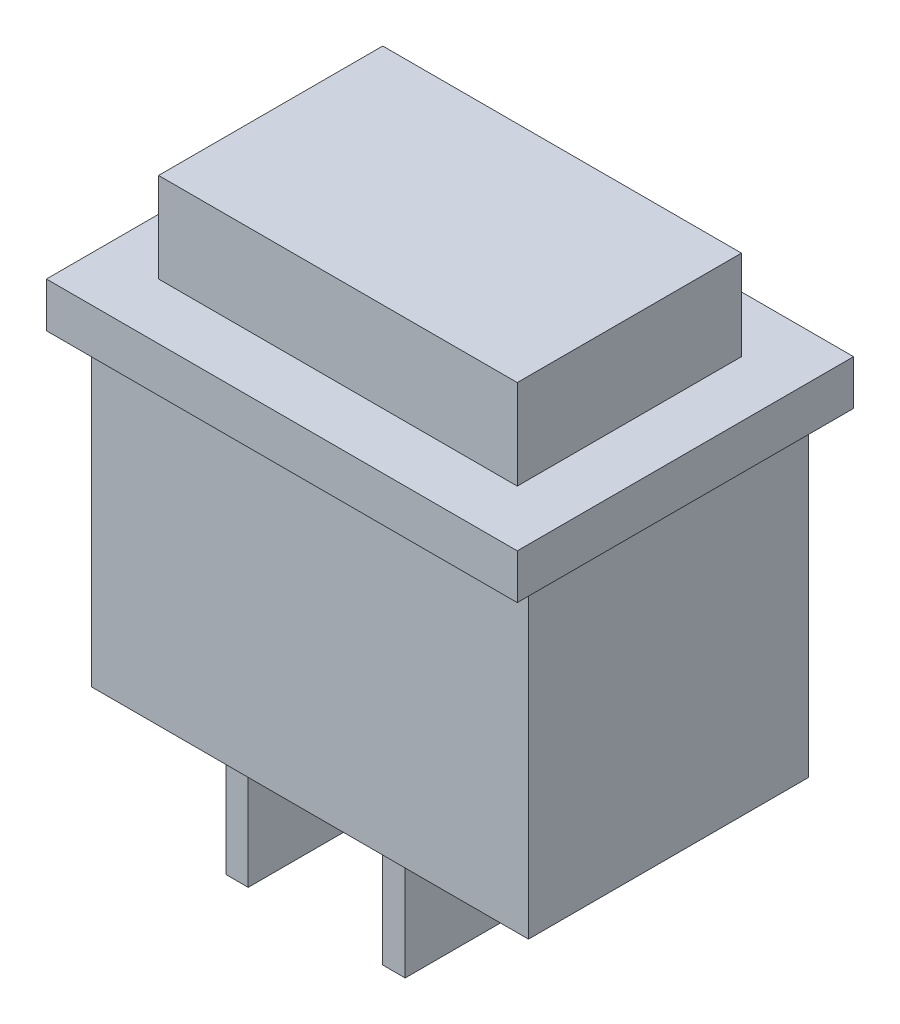
ISO-10303-21;
HEADER;
FILE_DESCRIPTION(('STEP AP214'),'2;1');
FILE_NAME('part.step','',(''),(''),'','','');
FILE_SCHEMA(('AUTOMOTIVE_DESIGN { 1 0 10303 214 1 1 1 1 }'));
ENDSEC;
DATA;
#1=APPLICATION_CONTEXT('core data for automotive mechanical design processes');
#2=APPLICATION_PROTOCOL_DEFINITION('international standard','automotive_design',2000,#1);
#3=PRODUCT_CONTEXT('',#1,'mechanical');
#4=PRODUCT('Part','Part','',(#3));
#5=PRODUCT_RELATED_PRODUCT_CATEGORY('part','',(#4));
#6=PRODUCT_DEFINITION_FORMATION('','',#4);
#7=PRODUCT_DEFINITION_CONTEXT('part definition',#1,'design');
#8=PRODUCT_DEFINITION('design','',#6,#7);
#9=PRODUCT_DEFINITION_SHAPE('','',#8);
#10=(LENGTH_UNIT() NAMED_UNIT(*) SI_UNIT(.MILLI.,.METRE.));
#11=(NAMED_UNIT(*) PLANE_ANGLE_UNIT() SI_UNIT($,.RADIAN.));
#12=(NAMED_UNIT(*) SI_UNIT($,.STERADIAN.) SOLID_ANGLE_UNIT());
#13=UNCERTAINTY_MEASURE_WITH_UNIT(LENGTH_MEASURE(1.E-05),#10,'distance_accuracy_value','');
#14=(GEOMETRIC_REPRESENTATION_CONTEXT(3) GLOBAL_UNCERTAINTY_ASSIGNED_CONTEXT((#13)) GLOBAL_UNIT_ASSIGNED_CONTEXT((#10,
#11,#12)) REPRESENTATION_CONTEXT('',''));
#15=CARTESIAN_POINT('',(0.,0.,0.));
#16=DIRECTION('',(0.,0.,1.));
#17=DIRECTION('',(1.,0.,0.));
#18=AXIS2_PLACEMENT_3D('',#15,#16,#17);
#19=CARTESIAN_POINT('',(0.,-14.,0.));
#20=DIRECTION('',(0.,-1.,0.));
#21=DIRECTION('',(0.,0.,-1.));
#22=AXIS2_PLACEMENT_3D('',#19,#20,#21);
#23=PLANE('',#22);
#24=DIRECTION('',(0.,0.,1.));
#25=VECTOR('',#24,1.);
#26=CARTESIAN_POINT('',(9.75,-14.,6.25));
#27=LINE('',#26,#25);
#28=CARTESIAN_POINT('',(9.75,-14.,-6.25));
#29=VERTEX_POINT('',#28);
#30=CARTESIAN_POINT('',(9.75,-14.,6.25));
#31=VERTEX_POINT('',#30);
#32=EDGE_CURVE('E228',#29,#31,#27,.T.);
#33=ORIENTED_EDGE('',*,*,#32,.T.);
#34=DIRECTION('',(-1.,0.,0.));
#35=VECTOR('',#34,1.);
#36=CARTESIAN_POINT('',(-9.75,-14.,6.25));
#37=LINE('',#36,#35);
#38=CARTESIAN_POINT('',(-9.75,-14.,6.25));
#39=VERTEX_POINT('',#38);
#40=EDGE_CURVE('E231',#31,#39,#37,.T.);
#41=ORIENTED_EDGE('',*,*,#40,.T.);
#42=DIRECTION('',(0.,0.,-1.));
#43=VECTOR('',#42,1.);
#44=CARTESIAN_POINT('',(-9.75,-14.,6.25));
#45=LINE('',#44,#43);
#46=CARTESIAN_POINT('',(-9.75,-14.,-6.25));
#47=VERTEX_POINT('',#46);
#48=EDGE_CURVE('E234',#39,#47,#45,.T.);
#49=ORIENTED_EDGE('',*,*,#48,.T.);
#50=DIRECTION('',(1.,0.,0.));
#51=VECTOR('',#50,1.);
#52=CARTESIAN_POINT('',(-9.75,-14.,-6.25));
#53=LINE('',#52,#51);
#54=EDGE_CURVE('E236',#47,#29,#53,.T.);
#55=ORIENTED_EDGE('',*,*,#54,.T.);
#56=EDGE_LOOP('',(#33,#41,#49,#55));
#57=FACE_BOUND('',#56,.T.);
#58=DIRECTION('',(-1.,0.,0.));
#59=VECTOR('',#58,1.);
#60=CARTESIAN_POINT('',(-7.5,-14.,2.5));
#61=LINE('',#60,#59);
#62=CARTESIAN_POINT('',(-6.5,-14.,2.5));
#63=VERTEX_POINT('',#62);
#64=CARTESIAN_POINT('',(-7.5,-14.,2.5));
#65=VERTEX_POINT('',#64);
#66=EDGE_CURVE('E199',#63,#65,#61,.T.);
#67=ORIENTED_EDGE('',*,*,#66,.F.);
#68=DIRECTION('',(0.,0.,1.));
#69=VECTOR('',#68,1.);
#70=CARTESIAN_POINT('',(-6.5,-14.,-2.5));
#71=LINE('',#70,#69);
#72=CARTESIAN_POINT('',(-6.5,-14.,-2.5));
#73=VERTEX_POINT('',#72);
#74=EDGE_CURVE('E196',#73,#63,#71,.T.);
#75=ORIENTED_EDGE('',*,*,#74,.F.);
#76=DIRECTION('',(1.,0.,0.));
#77=VECTOR('',#76,1.);
#78=CARTESIAN_POINT('',(-7.5,-14.,-2.5));
#79=LINE('',#78,#77);
#80=CARTESIAN_POINT('',(-7.5,-14.,-2.5));
#81=VERTEX_POINT('',#80);
#82=EDGE_CURVE('E208',#81,#73,#79,.T.);
#83=ORIENTED_EDGE('',*,*,#82,.F.);
#84=DIRECTION('',(0.,0.,-1.));
#85=VECTOR('',#84,1.);
#86=CARTESIAN_POINT('',(-7.5,-14.,-2.5));
#87=LINE('',#86,#85);
#88=EDGE_CURVE('E216',#65,#81,#87,.T.);
#89=ORIENTED_EDGE('',*,*,#88,.F.);
#90=EDGE_LOOP('',(#67,#75,#83,#89));
#91=FACE_BOUND('',#90,.T.);
#92=DIRECTION('',(-1.,0.,0.));
#93=VECTOR('',#92,1.);
#94=CARTESIAN_POINT('',(-0.5,-14.,2.5));
#95=LINE('',#94,#93);
#96=CARTESIAN_POINT('',(0.5,-14.,2.5));
#97=VERTEX_POINT('',#96);
#98=CARTESIAN_POINT('',(-0.5,-14.,2.5));
#99=VERTEX_POINT('',#98);
#100=EDGE_CURVE('E581',#97,#99,#95,.T.);
#101=ORIENTED_EDGE('',*,*,#100,.F.);
#102=DIRECTION('',(0.,0.,1.));
#103=VECTOR('',#102,1.);
#104=CARTESIAN_POINT('',(0.5,-14.,-2.5));
#105=LINE('',#104,#103);
#106=CARTESIAN_POINT('',(0.5,-14.,-2.5));
#107=VERTEX_POINT('',#106);
#108=EDGE_CURVE('E194',#107,#97,#105,.T.);
#109=ORIENTED_EDGE('',*,*,#108,.F.);
#110=DIRECTION('',(1.,0.,0.));
#111=VECTOR('',#110,1.);
#112=CARTESIAN_POINT('',(-0.5,-14.,-2.5));
#113=LINE('',#112,#111);
#114=CARTESIAN_POINT('',(-0.5,-14.,-2.5));
#115=VERTEX_POINT('',#114);
#116=EDGE_CURVE('E190',#115,#107,#113,.T.);
#117=ORIENTED_EDGE('',*,*,#116,.F.);
#118=DIRECTION('',(0.,0.,-1.));
#119=VECTOR('',#118,1.);
#120=CARTESIAN_POINT('',(-0.5,-14.,-2.5));
#121=LINE('',#120,#119);
#122=EDGE_CURVE('E578',#99,#115,#121,.T.);
#123=ORIENTED_EDGE('',*,*,#122,.F.);
#124=EDGE_LOOP('',(#101,#109,#117,#123));
#125=FACE_BOUND('',#124,.T.);
#126=ADVANCED_FACE('F33',(#57,#91,#125),#23,.T.);
#127=CARTESIAN_POINT('',(0.,0.,0.));
#128=DIRECTION('',(0.,1.,0.));
#129=DIRECTION('',(0.,0.,1.));
#130=AXIS2_PLACEMENT_3D('',#127,#128,#129);
#131=PLANE('',#130);
#132=DIRECTION('',(0.,0.,-1.));
#133=VECTOR('',#132,1.);
#134=CARTESIAN_POINT('',(10.5,0.,-7.5));
#135=LINE('',#134,#133);
#136=CARTESIAN_POINT('',(10.5,0.,7.5));
#137=VERTEX_POINT('',#136);
#138=CARTESIAN_POINT('',(10.5,0.,-7.5));
#139=VERTEX_POINT('',#138);
#140=EDGE_CURVE('E289',#137,#139,#135,.T.);
#141=ORIENTED_EDGE('',*,*,#140,.F.);
#142=DIRECTION('',(1.,0.,0.));
#143=VECTOR('',#142,1.);
#144=CARTESIAN_POINT('',(-10.5,0.,7.5));
#145=LINE('',#144,#143);
#146=CARTESIAN_POINT('',(-10.5,0.,7.5));
#147=VERTEX_POINT('',#146);
#148=EDGE_CURVE('E294',#147,#137,#145,.T.);
#149=ORIENTED_EDGE('',*,*,#148,.F.);
#150=DIRECTION('',(0.,0.,1.));
#151=VECTOR('',#150,1.);
#152=CARTESIAN_POINT('',(-10.5,0.,-7.5));
#153=LINE('',#152,#151);
#154=CARTESIAN_POINT('',(-10.5,0.,-7.5));
#155=VERTEX_POINT('',#154);
#156=EDGE_CURVE('E305',#155,#147,#153,.T.);
#157=ORIENTED_EDGE('',*,*,#156,.F.);
#158=DIRECTION('',(-1.,0.,0.));
#159=VECTOR('',#158,1.);
#160=CARTESIAN_POINT('',(-10.5,0.,-7.5));
#161=LINE('',#160,#159);
#162=EDGE_CURVE('E303',#139,#155,#161,.T.);
#163=ORIENTED_EDGE('',*,*,#162,.F.);
#164=EDGE_LOOP('',(#141,#149,#157,#163));
#165=FACE_BOUND('',#164,.T.);
#166=DIRECTION('',(0.,0.,1.));
#167=VECTOR('',#166,1.);
#168=CARTESIAN_POINT('',(9.75,0.,6.25));
#169=LINE('',#168,#167);
#170=CARTESIAN_POINT('',(9.75,0.,-6.25));
#171=VERTEX_POINT('',#170);
#172=CARTESIAN_POINT('',(9.75,0.,6.25));
#173=VERTEX_POINT('',#172);
#174=EDGE_CURVE('E227',#171,#173,#169,.T.);
#175=ORIENTED_EDGE('',*,*,#174,.F.);
#176=DIRECTION('',(1.,0.,0.));
#177=VECTOR('',#176,1.);
#178=CARTESIAN_POINT('',(-9.75,0.,-6.25));
#179=LINE('',#178,#177);
#180=CARTESIAN_POINT('',(-9.75,0.,-6.25));
#181=VERTEX_POINT('',#180);
#182=EDGE_CURVE('E232',#181,#171,#179,.T.);
#183=ORIENTED_EDGE('',*,*,#182,.F.);
#184=DIRECTION('',(0.,0.,-1.));
#185=VECTOR('',#184,1.);
#186=CARTESIAN_POINT('',(-9.75,0.,6.25));
#187=LINE('',#186,#185);
#188=CARTESIAN_POINT('',(-9.75,0.,6.25));
#189=VERTEX_POINT('',#188);
#190=EDGE_CURVE('E244',#189,#181,#187,.T.);
#191=ORIENTED_EDGE('',*,*,#190,.F.);
#192=DIRECTION('',(-1.,0.,0.));
#193=VECTOR('',#192,1.);
#194=CARTESIAN_POINT('',(-9.75,0.,6.25));
#195=LINE('',#194,#193);
#196=EDGE_CURVE('E241',#173,#189,#195,.T.);
#197=ORIENTED_EDGE('',*,*,#196,.F.);
#198=EDGE_LOOP('',(#175,#183,#191,#197));
#199=FACE_BOUND('',#198,.T.);
#200=ADVANCED_FACE('F323',(#165,#199),#131,.F.);
#201=CARTESIAN_POINT('',(0.,2.,0.));
#202=DIRECTION('',(0.,1.,0.));
#203=DIRECTION('',(0.,0.,1.));
#204=AXIS2_PLACEMENT_3D('',#201,#202,#203);
#205=PLANE('',#204);
#206=DIRECTION('',(0.,0.,-1.));
#207=VECTOR('',#206,1.);
#208=CARTESIAN_POINT('',(10.5,2.,-7.5));
#209=LINE('',#208,#207);
#210=CARTESIAN_POINT('',(10.5,2.,7.5));
#211=VERTEX_POINT('',#210);
#212=CARTESIAN_POINT('',(10.5,2.,-7.5));
#213=VERTEX_POINT('',#212);
#214=EDGE_CURVE('E290',#211,#213,#209,.T.);
#215=ORIENTED_EDGE('',*,*,#214,.T.);
#216=DIRECTION('',(-1.,0.,0.));
#217=VECTOR('',#216,1.);
#218=CARTESIAN_POINT('',(-10.5,2.,-7.5));
#219=LINE('',#218,#217);
#220=CARTESIAN_POINT('',(-10.5,2.,-7.5));
#221=VERTEX_POINT('',#220);
#222=EDGE_CURVE('E293',#213,#221,#219,.T.);
#223=ORIENTED_EDGE('',*,*,#222,.T.);
#224=DIRECTION('',(0.,0.,1.));
#225=VECTOR('',#224,1.);
#226=CARTESIAN_POINT('',(-10.5,2.,-7.5));
#227=LINE('',#226,#225);
#228=CARTESIAN_POINT('',(-10.5,2.,7.5));
#229=VERTEX_POINT('',#228);
#230=EDGE_CURVE('E296',#221,#229,#227,.T.);
#231=ORIENTED_EDGE('',*,*,#230,.T.);
#232=DIRECTION('',(1.,0.,0.));
#233=VECTOR('',#232,1.);
#234=CARTESIAN_POINT('',(-10.5,2.,7.5));
#235=LINE('',#234,#233);
#236=EDGE_CURVE('E298',#229,#211,#235,.T.);
#237=ORIENTED_EDGE('',*,*,#236,.T.);
#238=EDGE_LOOP('',(#215,#223,#231,#237));
#239=FACE_BOUND('',#238,.T.);
#240=DIRECTION('',(-1.,0.,0.));
#241=VECTOR('',#240,1.);
#242=CARTESIAN_POINT('',(-8.,2.,-5.));
#243=LINE('',#242,#241);
#244=CARTESIAN_POINT('',(8.,2.,-5.));
#245=VERTEX_POINT('',#244);
#246=CARTESIAN_POINT('',(-8.,2.,-5.));
#247=VERTEX_POINT('',#246);
#248=EDGE_CURVE('E274',#245,#247,#243,.T.);
#249=ORIENTED_EDGE('',*,*,#248,.F.);
#250=DIRECTION('',(0.,0.,-1.));
#251=VECTOR('',#250,1.);
#252=CARTESIAN_POINT('',(8.,2.,-5.));
#253=LINE('',#252,#251);
#254=CARTESIAN_POINT('',(8.,2.,5.));
#255=VERTEX_POINT('',#254);
#256=EDGE_CURVE('E260',#255,#245,#253,.T.);
#257=ORIENTED_EDGE('',*,*,#256,.F.);
#258=DIRECTION('',(1.,0.,0.));
#259=VECTOR('',#258,1.);
#260=CARTESIAN_POINT('',(-8.,2.,5.));
#261=LINE('',#260,#259);
#262=CARTESIAN_POINT('',(-8.,2.,5.));
#263=VERTEX_POINT('',#262);
#264=EDGE_CURVE('E265',#263,#255,#261,.T.);
#265=ORIENTED_EDGE('',*,*,#264,.F.);
#266=DIRECTION('',(0.,0.,1.));
#267=VECTOR('',#266,1.);
#268=CARTESIAN_POINT('',(-8.,2.,-5.));
#269=LINE('',#268,#267);
#270=EDGE_CURVE('E276',#247,#263,#269,.T.);
#271=ORIENTED_EDGE('',*,*,#270,.F.);
#272=EDGE_LOOP('',(#249,#257,#265,#271));
#273=FACE_BOUND('',#272,.T.);
#274=ADVANCED_FACE('F333',(#239,#273),#205,.T.);
#275=CARTESIAN_POINT('',(10.5,2.,-7.5));
#276=DIRECTION('',(-1.,0.,0.));
#277=DIRECTION('',(0.,0.,1.));
#278=AXIS2_PLACEMENT_3D('',#275,#276,#277);
#279=PLANE('',#278);
#280=ORIENTED_EDGE('',*,*,#140,.T.);
#281=DIRECTION('',(0.,-1.,0.));
#282=VECTOR('',#281,1.);
#283=CARTESIAN_POINT('',(10.5,2.,-7.5));
#284=LINE('',#283,#282);
#285=EDGE_CURVE('E11',#213,#139,#284,.T.);
#286=ORIENTED_EDGE('',*,*,#285,.F.);
#287=ORIENTED_EDGE('',*,*,#214,.F.);
#288=DIRECTION('',(0.,-1.,0.));
#289=VECTOR('',#288,1.);
#290=CARTESIAN_POINT('',(10.5,2.,7.5));
#291=LINE('',#290,#289);
#292=EDGE_CURVE('E300',#211,#137,#291,.T.);
#293=ORIENTED_EDGE('',*,*,#292,.T.);
#294=EDGE_LOOP('',(#280,#286,#287,#293));
#295=FACE_BOUND('',#294,.T.);
#296=ADVANCED_FACE('F35',(#295),#279,.F.);
#297=CARTESIAN_POINT('',(-10.5,2.,-7.5));
#298=DIRECTION('',(0.,0.,1.));
#299=DIRECTION('',(1.,0.,0.));
#300=AXIS2_PLACEMENT_3D('',#297,#298,#299);
#301=PLANE('',#300);
#302=ORIENTED_EDGE('',*,*,#162,.T.);
#303=DIRECTION('',(0.,-1.,0.));
#304=VECTOR('',#303,1.);
#305=CARTESIAN_POINT('',(-10.5,2.,-7.5));
#306=LINE('',#305,#304);
#307=EDGE_CURVE('E41',#221,#155,#306,.T.);
#308=ORIENTED_EDGE('',*,*,#307,.F.);
#309=ORIENTED_EDGE('',*,*,#222,.F.);
#310=ORIENTED_EDGE('',*,*,#285,.T.);
#311=EDGE_LOOP('',(#302,#308,#309,#310));
#312=FACE_BOUND('',#311,.T.);
#313=ADVANCED_FACE('F335',(#312),#301,.F.);
#314=CARTESIAN_POINT('',(-10.5,2.,-7.5));
#315=DIRECTION('',(1.,0.,0.));
#316=DIRECTION('',(0.,0.,-1.));
#317=AXIS2_PLACEMENT_3D('',#314,#315,#316);
#318=PLANE('',#317);
#319=ORIENTED_EDGE('',*,*,#156,.T.);
#320=DIRECTION('',(0.,-1.,0.));
#321=VECTOR('',#320,1.);
#322=CARTESIAN_POINT('',(-10.5,2.,7.5));
#323=LINE('',#322,#321);
#324=EDGE_CURVE('E310',#229,#147,#323,.T.);
#325=ORIENTED_EDGE('',*,*,#324,.F.);
#326=ORIENTED_EDGE('',*,*,#230,.F.);
#327=ORIENTED_EDGE('',*,*,#307,.T.);
#328=EDGE_LOOP('',(#319,#325,#326,#327));
#329=FACE_BOUND('',#328,.T.);
#330=ADVANCED_FACE('F317',(#329),#318,.F.);
#331=CARTESIAN_POINT('',(-10.5,2.,7.5));
#332=DIRECTION('',(0.,0.,-1.));
#333=DIRECTION('',(-1.,0.,0.));
#334=AXIS2_PLACEMENT_3D('',#331,#332,#333);
#335=PLANE('',#334);
#336=ORIENTED_EDGE('',*,*,#148,.T.);
#337=ORIENTED_EDGE('',*,*,#292,.F.);
#338=ORIENTED_EDGE('',*,*,#236,.F.);
#339=ORIENTED_EDGE('',*,*,#324,.T.);
#340=EDGE_LOOP('',(#336,#337,#338,#339));
#341=FACE_BOUND('',#340,.T.);
#342=ADVANCED_FACE('F327',(#341),#335,.F.);
#343=CARTESIAN_POINT('',(8.,6.,-5.));
#344=DIRECTION('',(-1.,0.,0.));
#345=DIRECTION('',(0.,0.,1.));
#346=AXIS2_PLACEMENT_3D('',#343,#344,#345);
#347=PLANE('',#346);
#348=ORIENTED_EDGE('',*,*,#256,.T.);
#349=DIRECTION('',(0.,-1.,0.));
#350=VECTOR('',#349,1.);
#351=CARTESIAN_POINT('',(8.,6.,-5.));
#352=LINE('',#351,#350);
#353=CARTESIAN_POINT('',(8.,6.,-5.));
#354=VERTEX_POINT('',#353);
#355=EDGE_CURVE('E287',#354,#245,#352,.T.);
#356=ORIENTED_EDGE('',*,*,#355,.F.);
#357=DIRECTION('',(0.,0.,-1.));
#358=VECTOR('',#357,1.);
#359=CARTESIAN_POINT('',(8.,6.,-5.));
#360=LINE('',#359,#358);
#361=CARTESIAN_POINT('',(8.,6.,5.));
#362=VERTEX_POINT('',#361);
#363=EDGE_CURVE('E261',#362,#354,#360,.T.);
#364=ORIENTED_EDGE('',*,*,#363,.F.);
#365=DIRECTION('',(0.,-1.,0.));
#366=VECTOR('',#365,1.);
#367=CARTESIAN_POINT('',(8.,6.,5.));
#368=LINE('',#367,#366);
#369=EDGE_CURVE('E271',#362,#255,#368,.T.);
#370=ORIENTED_EDGE('',*,*,#369,.T.);
#371=EDGE_LOOP('',(#348,#356,#364,#370));
#372=FACE_BOUND('',#371,.T.);
#373=ADVANCED_FACE('F385',(#372),#347,.F.);
#374=CARTESIAN_POINT('',(-8.,6.,-5.));
#375=DIRECTION('',(0.,0.,1.));
#376=DIRECTION('',(1.,0.,0.));
#377=AXIS2_PLACEMENT_3D('',#374,#375,#376);
#378=PLANE('',#377);
#379=ORIENTED_EDGE('',*,*,#248,.T.);
#380=DIRECTION('',(0.,-1.,0.));
#381=VECTOR('',#380,1.);
#382=CARTESIAN_POINT('',(-8.,6.,-5.));
#383=LINE('',#382,#381);
#384=CARTESIAN_POINT('',(-8.,6.,-5.));
#385=VERTEX_POINT('',#384);
#386=EDGE_CURVE('E284',#385,#247,#383,.T.);
#387=ORIENTED_EDGE('',*,*,#386,.F.);
#388=DIRECTION('',(-1.,0.,0.));
#389=VECTOR('',#388,1.);
#390=CARTESIAN_POINT('',(-8.,6.,-5.));
#391=LINE('',#390,#389);
#392=EDGE_CURVE('E264',#354,#385,#391,.T.);
#393=ORIENTED_EDGE('',*,*,#392,.F.);
#394=ORIENTED_EDGE('',*,*,#355,.T.);
#395=EDGE_LOOP('',(#379,#387,#393,#394));
#396=FACE_BOUND('',#395,.T.);
#397=ADVANCED_FACE('F381',(#396),#378,.F.);
#398=CARTESIAN_POINT('',(-8.,6.,-5.));
#399=DIRECTION('',(1.,0.,0.));
#400=DIRECTION('',(0.,0.,-1.));
#401=AXIS2_PLACEMENT_3D('',#398,#399,#400);
#402=PLANE('',#401);
#403=ORIENTED_EDGE('',*,*,#270,.T.);
#404=DIRECTION('',(0.,-1.,0.));
#405=VECTOR('',#404,1.);
#406=CARTESIAN_POINT('',(-8.,6.,5.));
#407=LINE('',#406,#405);
#408=CARTESIAN_POINT('',(-8.,6.,5.));
#409=VERTEX_POINT('',#408);
#410=EDGE_CURVE('E282',#409,#263,#407,.T.);
#411=ORIENTED_EDGE('',*,*,#410,.F.);
#412=DIRECTION('',(0.,0.,1.));
#413=VECTOR('',#412,1.);
#414=CARTESIAN_POINT('',(-8.,6.,-5.));
#415=LINE('',#414,#413);
#416=EDGE_CURVE('E267',#385,#409,#415,.T.);
#417=ORIENTED_EDGE('',*,*,#416,.F.);
#418=ORIENTED_EDGE('',*,*,#386,.T.);
#419=EDGE_LOOP('',(#403,#411,#417,#418));
#420=FACE_BOUND('',#419,.T.);
#421=ADVANCED_FACE('F377',(#420),#402,.F.);
#422=CARTESIAN_POINT('',(-8.,6.,5.));
#423=DIRECTION('',(0.,0.,-1.));
#424=DIRECTION('',(-1.,0.,0.));
#425=AXIS2_PLACEMENT_3D('',#422,#423,#424);
#426=PLANE('',#425);
#427=ORIENTED_EDGE('',*,*,#264,.T.);
#428=ORIENTED_EDGE('',*,*,#369,.F.);
#429=DIRECTION('',(1.,0.,0.));
#430=VECTOR('',#429,1.);
#431=CARTESIAN_POINT('',(-8.,6.,5.));
#432=LINE('',#431,#430);
#433=EDGE_CURVE('E269',#409,#362,#432,.T.);
#434=ORIENTED_EDGE('',*,*,#433,.F.);
#435=ORIENTED_EDGE('',*,*,#410,.T.);
#436=EDGE_LOOP('',(#427,#428,#434,#435));
#437=FACE_BOUND('',#436,.T.);
#438=ADVANCED_FACE('F373',(#437),#426,.F.);
#439=CARTESIAN_POINT('',(0.,6.,0.));
#440=DIRECTION('',(0.,1.,0.));
#441=DIRECTION('',(0.,0.,1.));
#442=AXIS2_PLACEMENT_3D('',#439,#440,#441);
#443=PLANE('',#442);
#444=ORIENTED_EDGE('',*,*,#363,.T.);
#445=ORIENTED_EDGE('',*,*,#392,.T.);
#446=ORIENTED_EDGE('',*,*,#416,.T.);
#447=ORIENTED_EDGE('',*,*,#433,.T.);
#448=EDGE_LOOP('',(#444,#445,#446,#447));
#449=FACE_BOUND('',#448,.T.);
#450=ADVANCED_FACE('F369',(#449),#443,.T.);
#451=CARTESIAN_POINT('',(9.75,-14.,6.25));
#452=DIRECTION('',(-1.,0.,0.));
#453=DIRECTION('',(0.,0.,1.));
#454=AXIS2_PLACEMENT_3D('',#451,#452,#453);
#455=PLANE('',#454);
#456=ORIENTED_EDGE('',*,*,#174,.T.);
#457=DIRECTION('',(0.,1.,0.));
#458=VECTOR('',#457,1.);
#459=CARTESIAN_POINT('',(9.75,-14.,6.25));
#460=LINE('',#459,#458);
#461=EDGE_CURVE('E257',#31,#173,#460,.T.);
#462=ORIENTED_EDGE('',*,*,#461,.F.);
#463=ORIENTED_EDGE('',*,*,#32,.F.);
#464=DIRECTION('',(0.,1.,0.));
#465=VECTOR('',#464,1.);
#466=CARTESIAN_POINT('',(9.75,-14.,-6.25));
#467=LINE('',#466,#465);
#468=EDGE_CURVE('E238',#29,#171,#467,.T.);
#469=ORIENTED_EDGE('',*,*,#468,.T.);
#470=EDGE_LOOP('',(#456,#462,#463,#469));
#471=FACE_BOUND('',#470,.T.);
#472=ADVANCED_FACE('F365',(#471),#455,.F.);
#473=CARTESIAN_POINT('',(-9.75,-14.,6.25));
#474=DIRECTION('',(0.,0.,-1.));
#475=DIRECTION('',(-1.,0.,0.));
#476=AXIS2_PLACEMENT_3D('',#473,#474,#475);
#477=PLANE('',#476);
#478=ORIENTED_EDGE('',*,*,#196,.T.);
#479=DIRECTION('',(0.,1.,0.));
#480=VECTOR('',#479,1.);
#481=CARTESIAN_POINT('',(-9.75,-14.,6.25));
#482=LINE('',#481,#480);
#483=EDGE_CURVE('E254',#39,#189,#482,.T.);
#484=ORIENTED_EDGE('',*,*,#483,.F.);
#485=ORIENTED_EDGE('',*,*,#40,.F.);
#486=ORIENTED_EDGE('',*,*,#461,.T.);
#487=EDGE_LOOP('',(#478,#484,#485,#486));
#488=FACE_BOUND('',#487,.T.);
#489=ADVANCED_FACE('F361',(#488),#477,.F.);
#490=CARTESIAN_POINT('',(-9.75,-14.,6.25));
#491=DIRECTION('',(1.,0.,0.));
#492=DIRECTION('',(0.,0.,-1.));
#493=AXIS2_PLACEMENT_3D('',#490,#491,#492);
#494=PLANE('',#493);
#495=ORIENTED_EDGE('',*,*,#190,.T.);
#496=DIRECTION('',(0.,1.,0.));
#497=VECTOR('',#496,1.);
#498=CARTESIAN_POINT('',(-9.75,-14.,-6.25));
#499=LINE('',#498,#497);
#500=EDGE_CURVE('E251',#47,#181,#499,.T.);
#501=ORIENTED_EDGE('',*,*,#500,.F.);
#502=ORIENTED_EDGE('',*,*,#48,.F.);
#503=ORIENTED_EDGE('',*,*,#483,.T.);
#504=EDGE_LOOP('',(#495,#501,#502,#503));
#505=FACE_BOUND('',#504,.T.);
#506=ADVANCED_FACE('F357',(#505),#494,.F.);
#507=CARTESIAN_POINT('',(-9.75,-14.,-6.25));
#508=DIRECTION('',(0.,0.,1.));
#509=DIRECTION('',(1.,0.,0.));
#510=AXIS2_PLACEMENT_3D('',#507,#508,#509);
#511=PLANE('',#510);
#512=ORIENTED_EDGE('',*,*,#182,.T.);
#513=ORIENTED_EDGE('',*,*,#468,.F.);
#514=ORIENTED_EDGE('',*,*,#54,.F.);
#515=ORIENTED_EDGE('',*,*,#500,.T.);
#516=EDGE_LOOP('',(#512,#513,#514,#515));
#517=FACE_BOUND('',#516,.T.);
#518=ADVANCED_FACE('F354',(#517),#511,.F.);
#519=CARTESIAN_POINT('',(-6.5,-22.,-2.5));
#520=DIRECTION('',(-1.,0.,0.));
#521=DIRECTION('',(0.,0.,1.));
#522=AXIS2_PLACEMENT_3D('',#519,#520,#521);
#523=PLANE('',#522);
#524=ORIENTED_EDGE('',*,*,#74,.T.);
#525=DIRECTION('',(0.,1.,0.));
#526=VECTOR('',#525,1.);
#527=CARTESIAN_POINT('',(-6.5,-22.,2.5));
#528=LINE('',#527,#526);
#529=CARTESIAN_POINT('',(-6.5,-22.,2.5));
#530=VERTEX_POINT('',#529);
#531=EDGE_CURVE('E225',#530,#63,#528,.T.);
#532=ORIENTED_EDGE('',*,*,#531,.F.);
#533=DIRECTION('',(0.,0.,1.));
#534=VECTOR('',#533,1.);
#535=CARTESIAN_POINT('',(-6.5,-22.,-2.5));
#536=LINE('',#535,#534);
#537=CARTESIAN_POINT('',(-6.5,-22.,-2.5));
#538=VERTEX_POINT('',#537);
#539=EDGE_CURVE('E204',#538,#530,#536,.T.);
#540=ORIENTED_EDGE('',*,*,#539,.F.);
#541=DIRECTION('',(0.,1.,0.));
#542=VECTOR('',#541,1.);
#543=CARTESIAN_POINT('',(-6.5,-22.,-2.5));
#544=LINE('',#543,#542);
#545=EDGE_CURVE('E213',#538,#73,#544,.T.);
#546=ORIENTED_EDGE('',*,*,#545,.T.);
#547=EDGE_LOOP('',(#524,#532,#540,#546));
#548=FACE_BOUND('',#547,.T.);
#549=ADVANCED_FACE('F352',(#548),#523,.F.);
#550=CARTESIAN_POINT('',(-7.5,-22.,2.5));
#551=DIRECTION('',(0.,0.,-1.));
#552=DIRECTION('',(-1.,0.,0.));
#553=AXIS2_PLACEMENT_3D('',#550,#551,#552);
#554=PLANE('',#553);
#555=ORIENTED_EDGE('',*,*,#66,.T.);
#556=DIRECTION('',(0.,1.,0.));
#557=VECTOR('',#556,1.);
#558=CARTESIAN_POINT('',(-7.5,-22.,2.5));
#559=LINE('',#558,#557);
#560=CARTESIAN_POINT('',(-7.5,-22.,2.5));
#561=VERTEX_POINT('',#560);
#562=EDGE_CURVE('E222',#561,#65,#559,.T.);
#563=ORIENTED_EDGE('',*,*,#562,.F.);
#564=DIRECTION('',(-1.,0.,0.));
#565=VECTOR('',#564,1.);
#566=CARTESIAN_POINT('',(-7.5,-22.,2.5));
#567=LINE('',#566,#565);
#568=EDGE_CURVE('E207',#530,#561,#567,.T.);
#569=ORIENTED_EDGE('',*,*,#568,.F.);
#570=ORIENTED_EDGE('',*,*,#531,.T.);
#571=EDGE_LOOP('',(#555,#563,#569,#570));
#572=FACE_BOUND('',#571,.T.);
#573=ADVANCED_FACE('F441',(#572),#554,.F.);
#574=CARTESIAN_POINT('',(-7.5,-22.,-2.5));
#575=DIRECTION('',(1.,0.,0.));
#576=DIRECTION('',(0.,0.,-1.));
#577=AXIS2_PLACEMENT_3D('',#574,#575,#576);
#578=PLANE('',#577);
#579=ORIENTED_EDGE('',*,*,#88,.T.);
#580=DIRECTION('',(0.,1.,0.));
#581=VECTOR('',#580,1.);
#582=CARTESIAN_POINT('',(-7.5,-22.,-2.5));
#583=LINE('',#582,#581);
#584=CARTESIAN_POINT('',(-7.5,-22.,-2.5));
#585=VERTEX_POINT('',#584);
#586=EDGE_CURVE('E56',#585,#81,#583,.T.);
#587=ORIENTED_EDGE('',*,*,#586,.F.);
#588=DIRECTION('',(0.,0.,-1.));
#589=VECTOR('',#588,1.);
#590=CARTESIAN_POINT('',(-7.5,-22.,-2.5));
#591=LINE('',#590,#589);
#592=EDGE_CURVE('E210',#561,#585,#591,.T.);
#593=ORIENTED_EDGE('',*,*,#592,.F.);
#594=ORIENTED_EDGE('',*,*,#562,.T.);
#595=EDGE_LOOP('',(#579,#587,#593,#594));
#596=FACE_BOUND('',#595,.T.);
#597=ADVANCED_FACE('F448',(#596),#578,.F.);
#598=CARTESIAN_POINT('',(-7.5,-22.,-2.5));
#599=DIRECTION('',(0.,0.,1.));
#600=DIRECTION('',(1.,0.,0.));
#601=AXIS2_PLACEMENT_3D('',#598,#599,#600);
#602=PLANE('',#601);
#603=ORIENTED_EDGE('',*,*,#82,.T.);
#604=ORIENTED_EDGE('',*,*,#545,.F.);
#605=DIRECTION('',(1.,0.,0.));
#606=VECTOR('',#605,1.);
#607=CARTESIAN_POINT('',(-7.5,-22.,-2.5));
#608=LINE('',#607,#606);
#609=EDGE_CURVE('E212',#585,#538,#608,.T.);
#610=ORIENTED_EDGE('',*,*,#609,.F.);
#611=ORIENTED_EDGE('',*,*,#586,.T.);
#612=EDGE_LOOP('',(#603,#604,#610,#611));
#613=FACE_BOUND('',#612,.T.);
#614=ADVANCED_FACE('F455',(#613),#602,.F.);
#615=CARTESIAN_POINT('',(0.,-22.,0.));
#616=DIRECTION('',(0.,1.,0.));
#617=DIRECTION('',(0.,0.,1.));
#618=AXIS2_PLACEMENT_3D('',#615,#616,#617);
#619=PLANE('',#618);
#620=ORIENTED_EDGE('',*,*,#539,.T.);
#621=ORIENTED_EDGE('',*,*,#568,.T.);
#622=ORIENTED_EDGE('',*,*,#592,.T.);
#623=ORIENTED_EDGE('',*,*,#609,.T.);
#624=EDGE_LOOP('',(#620,#621,#622,#623));
#625=FACE_BOUND('',#624,.T.);
#626=ADVANCED_FACE('F463',(#625),#619,.F.);
#627=CARTESIAN_POINT('',(0.5,-22.,-2.5));
#628=DIRECTION('',(-1.,0.,0.));
#629=DIRECTION('',(0.,0.,1.));
#630=AXIS2_PLACEMENT_3D('',#627,#628,#629);
#631=PLANE('',#630);
#632=ORIENTED_EDGE('',*,*,#108,.T.);
#633=DIRECTION('',(0.,1.,0.));
#634=VECTOR('',#633,1.);
#635=CARTESIAN_POINT('',(0.5,-22.,2.5));
#636=LINE('',#635,#634);
#637=CARTESIAN_POINT('',(0.5,-22.,2.5));
#638=VERTEX_POINT('',#637);
#639=EDGE_CURVE('E175',#638,#97,#636,.T.);
#640=ORIENTED_EDGE('',*,*,#639,.F.);
#641=DIRECTION('',(0.,0.,1.));
#642=VECTOR('',#641,1.);
#643=CARTESIAN_POINT('',(0.5,-22.,-2.5));
#644=LINE('',#643,#642);
#645=CARTESIAN_POINT('',(0.5,-22.,-2.5));
#646=VERTEX_POINT('',#645);
#647=EDGE_CURVE('E182',#646,#638,#644,.T.);
#648=ORIENTED_EDGE('',*,*,#647,.F.);
#649=DIRECTION('',(0.,1.,0.));
#650=VECTOR('',#649,1.);
#651=CARTESIAN_POINT('',(0.5,-22.,-2.5));
#652=LINE('',#651,#650);
#653=EDGE_CURVE('E575',#646,#107,#652,.T.);
#654=ORIENTED_EDGE('',*,*,#653,.T.);
#655=EDGE_LOOP('',(#632,#640,#648,#654));
#656=FACE_BOUND('',#655,.T.);
#657=ADVANCED_FACE('F192',(#656),#631,.F.);
#658=CARTESIAN_POINT('',(-0.5,-22.,2.5));
#659=DIRECTION('',(0.,0.,-1.));
#660=DIRECTION('',(-1.,0.,0.));
#661=AXIS2_PLACEMENT_3D('',#658,#659,#660);
#662=PLANE('',#661);
#663=ORIENTED_EDGE('',*,*,#100,.T.);
#664=DIRECTION('',(0.,1.,0.));
#665=VECTOR('',#664,1.);
#666=CARTESIAN_POINT('',(-0.5,-22.,2.5));
#667=LINE('',#666,#665);
#668=CARTESIAN_POINT('',(-0.5,-22.,2.5));
#669=VERTEX_POINT('',#668);
#670=EDGE_CURVE('E178',#669,#99,#667,.T.);
#671=ORIENTED_EDGE('',*,*,#670,.F.);
#672=DIRECTION('',(-1.,0.,0.));
#673=VECTOR('',#672,1.);
#674=CARTESIAN_POINT('',(-0.5,-22.,2.5));
#675=LINE('',#674,#673);
#676=EDGE_CURVE('E171',#638,#669,#675,.T.);
#677=ORIENTED_EDGE('',*,*,#676,.F.);
#678=ORIENTED_EDGE('',*,*,#639,.T.);
#679=EDGE_LOOP('',(#663,#671,#677,#678));
#680=FACE_BOUND('',#679,.T.);
#681=ADVANCED_FACE('F173',(#680),#662,.F.);
#682=CARTESIAN_POINT('',(-0.5,-22.,-2.5));
#683=DIRECTION('',(1.,0.,0.));
#684=DIRECTION('',(0.,0.,-1.));
#685=AXIS2_PLACEMENT_3D('',#682,#683,#684);
#686=PLANE('',#685);
#687=ORIENTED_EDGE('',*,*,#122,.T.);
#688=DIRECTION('',(0.,1.,0.));
#689=VECTOR('',#688,1.);
#690=CARTESIAN_POINT('',(-0.5,-22.,-2.5));
#691=LINE('',#690,#689);
#692=CARTESIAN_POINT('',(-0.5,-22.,-2.5));
#693=VERTEX_POINT('',#692);
#694=EDGE_CURVE('E48',#693,#115,#691,.T.);
#695=ORIENTED_EDGE('',*,*,#694,.F.);
#696=DIRECTION('',(0.,0.,-1.));
#697=VECTOR('',#696,1.);
#698=CARTESIAN_POINT('',(-0.5,-22.,-2.5));
#699=LINE('',#698,#697);
#700=EDGE_CURVE('E181',#669,#693,#699,.T.);
#701=ORIENTED_EDGE('',*,*,#700,.F.);
#702=ORIENTED_EDGE('',*,*,#670,.T.);
#703=EDGE_LOOP('',(#687,#695,#701,#702));
#704=FACE_BOUND('',#703,.T.);
#705=ADVANCED_FACE('F483',(#704),#686,.F.);
#706=CARTESIAN_POINT('',(-0.5,-22.,-2.5));
#707=DIRECTION('',(0.,0.,1.));
#708=DIRECTION('',(1.,0.,0.));
#709=AXIS2_PLACEMENT_3D('',#706,#707,#708);
#710=PLANE('',#709);
#711=ORIENTED_EDGE('',*,*,#116,.T.);
#712=ORIENTED_EDGE('',*,*,#653,.F.);
#713=DIRECTION('',(1.,0.,0.));
#714=VECTOR('',#713,1.);
#715=CARTESIAN_POINT('',(-0.5,-22.,-2.5));
#716=LINE('',#715,#714);
#717=EDGE_CURVE('E186',#693,#646,#716,.T.);
#718=ORIENTED_EDGE('',*,*,#717,.F.);
#719=ORIENTED_EDGE('',*,*,#694,.T.);
#720=EDGE_LOOP('',(#711,#712,#718,#719));
#721=FACE_BOUND('',#720,.T.);
#722=ADVANCED_FACE('F490',(#721),#710,.F.);
#723=CARTESIAN_POINT('',(0.,-22.,0.));
#724=DIRECTION('',(0.,1.,0.));
#725=DIRECTION('',(0.,0.,1.));
#726=AXIS2_PLACEMENT_3D('',#723,#724,#725);
#727=PLANE('',#726);
#728=ORIENTED_EDGE('',*,*,#647,.T.);
#729=ORIENTED_EDGE('',*,*,#676,.T.);
#730=ORIENTED_EDGE('',*,*,#700,.T.);
#731=ORIENTED_EDGE('',*,*,#717,.T.);
#732=EDGE_LOOP('',(#728,#729,#730,#731));
#733=FACE_BOUND('',#732,.T.);
#734=ADVANCED_FACE('F185',(#733),#727,.F.);
#735=CLOSED_SHELL('',(#126,#200,#274,#296,#313,#330,#342,#373,#397,#421,#438,#450,#472,#489,
#506,#518,#549,#573,#597,#614,#626,#657,#681,#705,#722,#734));
#736=MANIFOLD_SOLID_BREP('B2',#735);
#737=ADVANCED_BREP_SHAPE_REPRESENTATION('',(#18,#736),#14);
#738=SHAPE_DEFINITION_REPRESENTATION(#9,#737);
ENDSEC;
END-ISO-10303-21;
